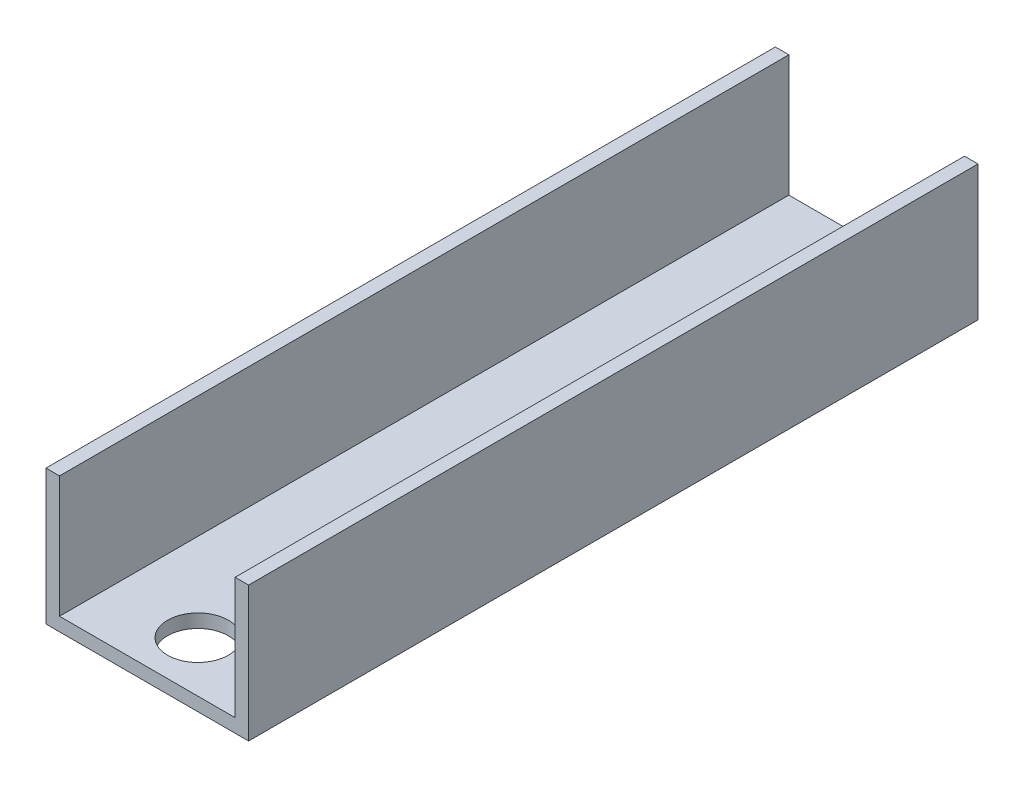
ISO-10303-21;
HEADER;
FILE_DESCRIPTION(('STEP AP214'),'2;1');
FILE_NAME('part.step','',(''),(''),'','','');
FILE_SCHEMA(('AUTOMOTIVE_DESIGN { 1 0 10303 214 1 1 1 1 }'));
ENDSEC;
DATA;
#1=APPLICATION_CONTEXT('core data for automotive mechanical design processes');
#2=APPLICATION_PROTOCOL_DEFINITION('international standard','automotive_design',2000,#1);
#3=PRODUCT_CONTEXT('',#1,'mechanical');
#4=PRODUCT('Part','Part','',(#3));
#5=PRODUCT_RELATED_PRODUCT_CATEGORY('part','',(#4));
#6=PRODUCT_DEFINITION_FORMATION('','',#4);
#7=PRODUCT_DEFINITION_CONTEXT('part definition',#1,'design');
#8=PRODUCT_DEFINITION('design','',#6,#7);
#9=PRODUCT_DEFINITION_SHAPE('','',#8);
#10=(LENGTH_UNIT() NAMED_UNIT(*) SI_UNIT(.MILLI.,.METRE.));
#11=(NAMED_UNIT(*) PLANE_ANGLE_UNIT() SI_UNIT($,.RADIAN.));
#12=(NAMED_UNIT(*) SI_UNIT($,.STERADIAN.) SOLID_ANGLE_UNIT());
#13=UNCERTAINTY_MEASURE_WITH_UNIT(LENGTH_MEASURE(1.E-05),#10,'distance_accuracy_value','');
#14=(GEOMETRIC_REPRESENTATION_CONTEXT(3) GLOBAL_UNCERTAINTY_ASSIGNED_CONTEXT((#13)) GLOBAL_UNIT_ASSIGNED_CONTEXT((#10,
#11,#12)) REPRESENTATION_CONTEXT('',''));
#15=CARTESIAN_POINT('',(0.,0.,0.));
#16=DIRECTION('',(0.,0.,1.));
#17=DIRECTION('',(1.,0.,0.));
#18=AXIS2_PLACEMENT_3D('',#15,#16,#17);
#19=CARTESIAN_POINT('',(-7.5,0.,54.));
#20=DIRECTION('',(1.,0.,0.));
#21=DIRECTION('',(0.,0.,-1.));
#22=AXIS2_PLACEMENT_3D('',#19,#20,#21);
#23=PLANE('',#22);
#24=DIRECTION('',(0.,-1.,0.));
#25=VECTOR('',#24,1.);
#26=CARTESIAN_POINT('',(-7.5,0.,0.));
#27=LINE('',#26,#25);
#28=CARTESIAN_POINT('',(-7.5,10.,0.));
#29=VERTEX_POINT('',#28);
#30=CARTESIAN_POINT('',(-7.5,0.,0.));
#31=VERTEX_POINT('',#30);
#32=EDGE_CURVE('E129',#29,#31,#27,.T.);
#33=ORIENTED_EDGE('',*,*,#32,.T.);
#34=DIRECTION('',(0.,0.,-1.));
#35=VECTOR('',#34,1.);
#36=CARTESIAN_POINT('',(-7.5,0.,54.));
#37=LINE('',#36,#35);
#38=CARTESIAN_POINT('',(-7.5,0.,54.));
#39=VERTEX_POINT('',#38);
#40=EDGE_CURVE('E11',#39,#31,#37,.T.);
#41=ORIENTED_EDGE('',*,*,#40,.F.);
#42=DIRECTION('',(0.,-1.,0.));
#43=VECTOR('',#42,1.);
#44=CARTESIAN_POINT('',(-7.5,0.,54.));
#45=LINE('',#44,#43);
#46=CARTESIAN_POINT('',(-7.5,10.,54.));
#47=VERTEX_POINT('',#46);
#48=EDGE_CURVE('E144',#47,#39,#45,.T.);
#49=ORIENTED_EDGE('',*,*,#48,.F.);
#50=DIRECTION('',(0.,0.,-1.));
#51=VECTOR('',#50,1.);
#52=CARTESIAN_POINT('',(-7.5,10.,54.));
#53=LINE('',#52,#51);
#54=EDGE_CURVE('E125',#47,#29,#53,.T.);
#55=ORIENTED_EDGE('',*,*,#54,.T.);
#56=EDGE_LOOP('',(#33,#41,#49,#55));
#57=FACE_BOUND('',#56,.T.);
#58=ADVANCED_FACE('F33',(#57),#23,.F.);
#59=CARTESIAN_POINT('',(-7.5,0.,54.));
#60=DIRECTION('',(0.,1.,0.));
#61=DIRECTION('',(0.,0.,1.));
#62=AXIS2_PLACEMENT_3D('',#59,#60,#61);
#63=PLANE('',#62);
#64=CARTESIAN_POINT('',(0.,0.,50.25));
#65=DIRECTION('',(0.,1.,0.));
#66=DIRECTION('',(0.,0.,1.));
#67=AXIS2_PLACEMENT_3D('',#64,#65,#66);
#68=CIRCLE('',#67,2.25);
#69=CARTESIAN_POINT('',(0.,0.,52.5));
#70=VERTEX_POINT('',#69);
#71=EDGE_CURVE('E182',#70,#70,#68,.T.);
#72=ORIENTED_EDGE('',*,*,#71,.T.);
#73=EDGE_LOOP('',(#72));
#74=FACE_BOUND('',#73,.T.);
#75=CARTESIAN_POINT('',(0.,0.,3.75));
#76=DIRECTION('',(0.,1.,0.));
#77=DIRECTION('',(0.,0.,1.));
#78=AXIS2_PLACEMENT_3D('',#75,#76,#77);
#79=CIRCLE('',#78,2.25);
#80=CARTESIAN_POINT('',(0.,0.,6.));
#81=VERTEX_POINT('',#80);
#82=EDGE_CURVE('E133',#81,#81,#79,.T.);
#83=ORIENTED_EDGE('',*,*,#82,.T.);
#84=EDGE_LOOP('',(#83));
#85=FACE_BOUND('',#84,.T.);
#86=DIRECTION('',(1.,0.,0.));
#87=VECTOR('',#86,1.);
#88=CARTESIAN_POINT('',(-7.5,0.,0.));
#89=LINE('',#88,#87);
#90=CARTESIAN_POINT('',(7.5,0.,0.));
#91=VERTEX_POINT('',#90);
#92=EDGE_CURVE('E132',#31,#91,#89,.T.);
#93=ORIENTED_EDGE('',*,*,#92,.T.);
#94=DIRECTION('',(0.,0.,-1.));
#95=VECTOR('',#94,1.);
#96=CARTESIAN_POINT('',(7.5,0.,54.));
#97=LINE('',#96,#95);
#98=CARTESIAN_POINT('',(7.5,0.,54.));
#99=VERTEX_POINT('',#98);
#100=EDGE_CURVE('E41',#99,#91,#97,.T.);
#101=ORIENTED_EDGE('',*,*,#100,.F.);
#102=DIRECTION('',(1.,0.,0.));
#103=VECTOR('',#102,1.);
#104=CARTESIAN_POINT('',(-7.5,0.,54.));
#105=LINE('',#104,#103);
#106=EDGE_CURVE('E92',#39,#99,#105,.T.);
#107=ORIENTED_EDGE('',*,*,#106,.F.);
#108=ORIENTED_EDGE('',*,*,#40,.T.);
#109=EDGE_LOOP('',(#93,#101,#107,#108));
#110=FACE_BOUND('',#109,.T.);
#111=ADVANCED_FACE('F203',(#74,#85,#110),#63,.F.);
#112=CARTESIAN_POINT('',(7.5,0.,54.));
#113=DIRECTION('',(-1.,0.,0.));
#114=DIRECTION('',(0.,0.,1.));
#115=AXIS2_PLACEMENT_3D('',#112,#113,#114);
#116=PLANE('',#115);
#117=DIRECTION('',(0.,1.,0.));
#118=VECTOR('',#117,1.);
#119=CARTESIAN_POINT('',(7.5,0.,0.));
#120=LINE('',#119,#118);
#121=CARTESIAN_POINT('',(7.5,10.,0.));
#122=VERTEX_POINT('',#121);
#123=EDGE_CURVE('E135',#91,#122,#120,.T.);
#124=ORIENTED_EDGE('',*,*,#123,.T.);
#125=DIRECTION('',(0.,0.,-1.));
#126=VECTOR('',#125,1.);
#127=CARTESIAN_POINT('',(7.5,10.,54.));
#128=LINE('',#127,#126);
#129=CARTESIAN_POINT('',(7.5,10.,54.));
#130=VERTEX_POINT('',#129);
#131=EDGE_CURVE('E151',#130,#122,#128,.T.);
#132=ORIENTED_EDGE('',*,*,#131,.F.);
#133=DIRECTION('',(0.,1.,0.));
#134=VECTOR('',#133,1.);
#135=CARTESIAN_POINT('',(7.5,0.,54.));
#136=LINE('',#135,#134);
#137=EDGE_CURVE('E159',#99,#130,#136,.T.);
#138=ORIENTED_EDGE('',*,*,#137,.F.);
#139=ORIENTED_EDGE('',*,*,#100,.T.);
#140=EDGE_LOOP('',(#124,#132,#138,#139));
#141=FACE_BOUND('',#140,.T.);
#142=ADVANCED_FACE('F157',(#141),#116,.F.);
#143=CARTESIAN_POINT('',(6.5,10.,54.));
#144=DIRECTION('',(0.,-1.,0.));
#145=DIRECTION('',(1.,0.,0.));
#146=AXIS2_PLACEMENT_3D('',#143,#144,#145);
#147=PLANE('',#146);
#148=DIRECTION('',(-1.,0.,0.));
#149=VECTOR('',#148,1.);
#150=CARTESIAN_POINT('',(6.5,10.,0.));
#151=LINE('',#150,#149);
#152=CARTESIAN_POINT('',(6.5,10.,0.));
#153=VERTEX_POINT('',#152);
#154=EDGE_CURVE('E137',#122,#153,#151,.T.);
#155=ORIENTED_EDGE('',*,*,#154,.T.);
#156=DIRECTION('',(0.,0.,-1.));
#157=VECTOR('',#156,1.);
#158=CARTESIAN_POINT('',(6.5,10.,54.));
#159=LINE('',#158,#157);
#160=CARTESIAN_POINT('',(6.5,10.,54.));
#161=VERTEX_POINT('',#160);
#162=EDGE_CURVE('E148',#161,#153,#159,.T.);
#163=ORIENTED_EDGE('',*,*,#162,.F.);
#164=DIRECTION('',(-1.,0.,0.));
#165=VECTOR('',#164,1.);
#166=CARTESIAN_POINT('',(6.5,10.,54.));
#167=LINE('',#166,#165);
#168=EDGE_CURVE('E171',#130,#161,#167,.T.);
#169=ORIENTED_EDGE('',*,*,#168,.F.);
#170=ORIENTED_EDGE('',*,*,#131,.T.);
#171=EDGE_LOOP('',(#155,#163,#169,#170));
#172=FACE_BOUND('',#171,.T.);
#173=ADVANCED_FACE('F167',(#172),#147,.F.);
#174=CARTESIAN_POINT('',(6.5,1.,54.));
#175=DIRECTION('',(1.,0.,0.));
#176=DIRECTION('',(0.,1.,0.));
#177=AXIS2_PLACEMENT_3D('',#174,#175,#176);
#178=PLANE('',#177);
#179=DIRECTION('',(0.,-1.,0.));
#180=VECTOR('',#179,1.);
#181=CARTESIAN_POINT('',(6.5,1.,0.));
#182=LINE('',#181,#180);
#183=CARTESIAN_POINT('',(6.5,1.,0.));
#184=VERTEX_POINT('',#183);
#185=EDGE_CURVE('E139',#153,#184,#182,.T.);
#186=ORIENTED_EDGE('',*,*,#185,.T.);
#187=DIRECTION('',(0.,0.,-1.));
#188=VECTOR('',#187,1.);
#189=CARTESIAN_POINT('',(6.5,1.,54.));
#190=LINE('',#189,#188);
#191=CARTESIAN_POINT('',(6.5,1.,54.));
#192=VERTEX_POINT('',#191);
#193=EDGE_CURVE('E120',#192,#184,#190,.T.);
#194=ORIENTED_EDGE('',*,*,#193,.F.);
#195=DIRECTION('',(0.,-1.,0.));
#196=VECTOR('',#195,1.);
#197=CARTESIAN_POINT('',(6.5,1.,54.));
#198=LINE('',#197,#196);
#199=EDGE_CURVE('E111',#161,#192,#198,.T.);
#200=ORIENTED_EDGE('',*,*,#199,.F.);
#201=ORIENTED_EDGE('',*,*,#162,.T.);
#202=EDGE_LOOP('',(#186,#194,#200,#201));
#203=FACE_BOUND('',#202,.T.);
#204=ADVANCED_FACE('F170',(#203),#178,.F.);
#205=CARTESIAN_POINT('',(-6.5,1.,54.));
#206=DIRECTION('',(0.,-1.,0.));
#207=DIRECTION('',(0.,0.,-1.));
#208=AXIS2_PLACEMENT_3D('',#205,#206,#207);
#209=PLANE('',#208);
#210=CARTESIAN_POINT('',(0.,1.,50.25));
#211=DIRECTION('',(0.,1.,0.));
#212=DIRECTION('',(0.,0.,-1.));
#213=AXIS2_PLACEMENT_3D('',#210,#211,#212);
#214=CIRCLE('',#213,2.25);
#215=CARTESIAN_POINT('',(0.,1.,48.));
#216=VERTEX_POINT('',#215);
#217=EDGE_CURVE('E185',#216,#216,#214,.T.);
#218=ORIENTED_EDGE('',*,*,#217,.F.);
#219=EDGE_LOOP('',(#218));
#220=FACE_BOUND('',#219,.T.);
#221=CARTESIAN_POINT('',(0.,1.,3.75));
#222=DIRECTION('',(0.,1.,0.));
#223=DIRECTION('',(0.,0.,1.));
#224=AXIS2_PLACEMENT_3D('',#221,#222,#223);
#225=CIRCLE('',#224,2.25);
#226=CARTESIAN_POINT('',(0.,1.,6.));
#227=VERTEX_POINT('',#226);
#228=EDGE_CURVE('E179',#227,#227,#225,.T.);
#229=ORIENTED_EDGE('',*,*,#228,.F.);
#230=EDGE_LOOP('',(#229));
#231=FACE_BOUND('',#230,.T.);
#232=DIRECTION('',(-1.,0.,0.));
#233=VECTOR('',#232,1.);
#234=CARTESIAN_POINT('',(-6.5,1.,0.));
#235=LINE('',#234,#233);
#236=CARTESIAN_POINT('',(-6.5,1.,0.));
#237=VERTEX_POINT('',#236);
#238=EDGE_CURVE('E119',#184,#237,#235,.T.);
#239=ORIENTED_EDGE('',*,*,#238,.T.);
#240=DIRECTION('',(0.,0.,-1.));
#241=VECTOR('',#240,1.);
#242=CARTESIAN_POINT('',(-6.5,1.,54.));
#243=LINE('',#242,#241);
#244=CARTESIAN_POINT('',(-6.5,1.,54.));
#245=VERTEX_POINT('',#244);
#246=EDGE_CURVE('E116',#245,#237,#243,.T.);
#247=ORIENTED_EDGE('',*,*,#246,.F.);
#248=DIRECTION('',(-1.,0.,0.));
#249=VECTOR('',#248,1.);
#250=CARTESIAN_POINT('',(-6.5,1.,54.));
#251=LINE('',#250,#249);
#252=EDGE_CURVE('E105',#192,#245,#251,.T.);
#253=ORIENTED_EDGE('',*,*,#252,.F.);
#254=ORIENTED_EDGE('',*,*,#193,.T.);
#255=EDGE_LOOP('',(#239,#247,#253,#254));
#256=FACE_BOUND('',#255,.T.);
#257=ADVANCED_FACE('F117',(#220,#231,#256),#209,.F.);
#258=CARTESIAN_POINT('',(-6.5,10.,54.));
#259=DIRECTION('',(-1.,0.,0.));
#260=DIRECTION('',(0.,0.,1.));
#261=AXIS2_PLACEMENT_3D('',#258,#259,#260);
#262=PLANE('',#261);
#263=DIRECTION('',(0.,1.,0.));
#264=VECTOR('',#263,1.);
#265=CARTESIAN_POINT('',(-6.5,10.,0.));
#266=LINE('',#265,#264);
#267=CARTESIAN_POINT('',(-6.5,10.,0.));
#268=VERTEX_POINT('',#267);
#269=EDGE_CURVE('E78',#237,#268,#266,.T.);
#270=ORIENTED_EDGE('',*,*,#269,.T.);
#271=DIRECTION('',(0.,0.,-1.));
#272=VECTOR('',#271,1.);
#273=CARTESIAN_POINT('',(-6.5,10.,54.));
#274=LINE('',#273,#272);
#275=CARTESIAN_POINT('',(-6.5,10.,54.));
#276=VERTEX_POINT('',#275);
#277=EDGE_CURVE('E121',#276,#268,#274,.T.);
#278=ORIENTED_EDGE('',*,*,#277,.F.);
#279=DIRECTION('',(0.,1.,0.));
#280=VECTOR('',#279,1.);
#281=CARTESIAN_POINT('',(-6.5,10.,54.));
#282=LINE('',#281,#280);
#283=EDGE_CURVE('E109',#245,#276,#282,.T.);
#284=ORIENTED_EDGE('',*,*,#283,.F.);
#285=ORIENTED_EDGE('',*,*,#246,.T.);
#286=EDGE_LOOP('',(#270,#278,#284,#285));
#287=FACE_BOUND('',#286,.T.);
#288=ADVANCED_FACE('F123',(#287),#262,.F.);
#289=CARTESIAN_POINT('',(-7.5,10.,54.));
#290=DIRECTION('',(0.,-1.,0.));
#291=DIRECTION('',(0.,0.,-1.));
#292=AXIS2_PLACEMENT_3D('',#289,#290,#291);
#293=PLANE('',#292);
#294=DIRECTION('',(-1.,0.,0.));
#295=VECTOR('',#294,1.);
#296=CARTESIAN_POINT('',(-7.5,10.,0.));
#297=LINE('',#296,#295);
#298=EDGE_CURVE('E84',#268,#29,#297,.T.);
#299=ORIENTED_EDGE('',*,*,#298,.T.);
#300=ORIENTED_EDGE('',*,*,#54,.F.);
#301=DIRECTION('',(-1.,0.,0.));
#302=VECTOR('',#301,1.);
#303=CARTESIAN_POINT('',(-7.5,10.,54.));
#304=LINE('',#303,#302);
#305=EDGE_CURVE('E49',#276,#47,#304,.T.);
#306=ORIENTED_EDGE('',*,*,#305,.F.);
#307=ORIENTED_EDGE('',*,*,#277,.T.);
#308=EDGE_LOOP('',(#299,#300,#306,#307));
#309=FACE_BOUND('',#308,.T.);
#310=ADVANCED_FACE('F209',(#309),#293,.F.);
#311=CARTESIAN_POINT('',(-7.5,10.,54.));
#312=DIRECTION('',(0.,0.,-1.));
#313=DIRECTION('',(-1.,0.,0.));
#314=AXIS2_PLACEMENT_3D('',#311,#312,#313);
#315=PLANE('',#314);
#316=ORIENTED_EDGE('',*,*,#48,.T.);
#317=ORIENTED_EDGE('',*,*,#106,.T.);
#318=ORIENTED_EDGE('',*,*,#137,.T.);
#319=ORIENTED_EDGE('',*,*,#168,.T.);
#320=ORIENTED_EDGE('',*,*,#199,.T.);
#321=ORIENTED_EDGE('',*,*,#252,.T.);
#322=ORIENTED_EDGE('',*,*,#283,.T.);
#323=ORIENTED_EDGE('',*,*,#305,.T.);
#324=EDGE_LOOP('',(#316,#317,#318,#319,#320,#321,#322,#323));
#325=FACE_BOUND('',#324,.T.);
#326=ADVANCED_FACE('F107',(#325),#315,.F.);
#327=CARTESIAN_POINT('',(-7.5,10.,0.));
#328=DIRECTION('',(0.,0.,-1.));
#329=DIRECTION('',(-1.,0.,0.));
#330=AXIS2_PLACEMENT_3D('',#327,#328,#329);
#331=PLANE('',#330);
#332=ORIENTED_EDGE('',*,*,#32,.F.);
#333=ORIENTED_EDGE('',*,*,#298,.F.);
#334=ORIENTED_EDGE('',*,*,#269,.F.);
#335=ORIENTED_EDGE('',*,*,#238,.F.);
#336=ORIENTED_EDGE('',*,*,#185,.F.);
#337=ORIENTED_EDGE('',*,*,#154,.F.);
#338=ORIENTED_EDGE('',*,*,#123,.F.);
#339=ORIENTED_EDGE('',*,*,#92,.F.);
#340=EDGE_LOOP('',(#332,#333,#334,#335,#336,#337,#338,#339));
#341=FACE_BOUND('',#340,.T.);
#342=ADVANCED_FACE('F163',(#341),#331,.T.);
#343=CARTESIAN_POINT('',(0.,-4.,3.75));
#344=DIRECTION('',(0.,1.,0.));
#345=DIRECTION('',(0.,0.,1.));
#346=AXIS2_PLACEMENT_3D('',#343,#344,#345);
#347=CYLINDRICAL_SURFACE('',#346,2.25);
#348=ORIENTED_EDGE('',*,*,#228,.T.);
#349=EDGE_LOOP('',(#348));
#350=FACE_BOUND('',#349,.T.);
#351=ORIENTED_EDGE('',*,*,#82,.F.);
#352=EDGE_LOOP('',(#351));
#353=FACE_BOUND('',#352,.T.);
#354=ADVANCED_FACE('F197',(#350,#353),#347,.F.);
#355=CARTESIAN_POINT('',(0.,-4.,50.25));
#356=DIRECTION('',(0.,1.,0.));
#357=DIRECTION('',(0.,0.,1.));
#358=AXIS2_PLACEMENT_3D('',#355,#356,#357);
#359=CYLINDRICAL_SURFACE('',#358,2.25);
#360=ORIENTED_EDGE('',*,*,#217,.T.);
#361=EDGE_LOOP('',(#360));
#362=FACE_BOUND('',#361,.T.);
#363=ORIENTED_EDGE('',*,*,#71,.F.);
#364=EDGE_LOOP('',(#363));
#365=FACE_BOUND('',#364,.T.);
#366=ADVANCED_FACE('F189',(#362,#365),#359,.F.);
#367=CLOSED_SHELL('',(#58,#111,#142,#173,#204,#257,#288,#310,#326,#342,#354,#366));
#368=MANIFOLD_SOLID_BREP('B2',#367);
#369=ADVANCED_BREP_SHAPE_REPRESENTATION('',(#18,#368),#14);
#370=SHAPE_DEFINITION_REPRESENTATION(#9,#369);
ENDSEC;
END-ISO-10303-21;
